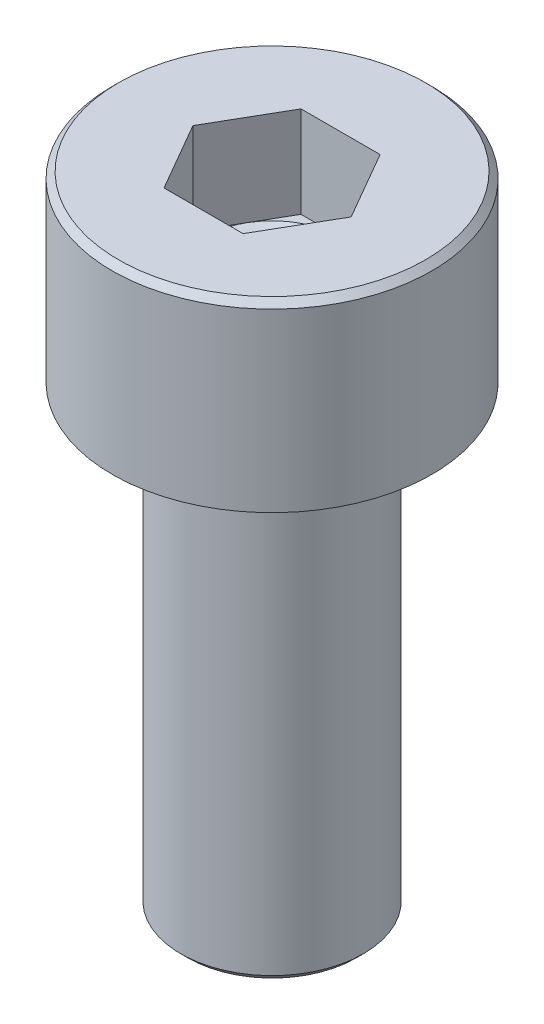
ISO-10303-21;
HEADER;
FILE_DESCRIPTION(('STEP AP214'),'2;1');
FILE_NAME('part.step','',(''),(''),'','','');
FILE_SCHEMA(('AUTOMOTIVE_DESIGN { 1 0 10303 214 1 1 1 1 }'));
ENDSEC;
DATA;
#1=APPLICATION_CONTEXT('core data for automotive mechanical design processes');
#2=APPLICATION_PROTOCOL_DEFINITION('international standard','automotive_design',2000,#1);
#3=PRODUCT_CONTEXT('',#1,'mechanical');
#4=PRODUCT('Part','Part','',(#3));
#5=PRODUCT_RELATED_PRODUCT_CATEGORY('part','',(#4));
#6=PRODUCT_DEFINITION_FORMATION('','',#4);
#7=PRODUCT_DEFINITION_CONTEXT('part definition',#1,'design');
#8=PRODUCT_DEFINITION('design','',#6,#7);
#9=PRODUCT_DEFINITION_SHAPE('','',#8);
#10=(LENGTH_UNIT() NAMED_UNIT(*) SI_UNIT(.MILLI.,.METRE.));
#11=(NAMED_UNIT(*) PLANE_ANGLE_UNIT() SI_UNIT($,.RADIAN.));
#12=(NAMED_UNIT(*) SI_UNIT($,.STERADIAN.) SOLID_ANGLE_UNIT());
#13=UNCERTAINTY_MEASURE_WITH_UNIT(LENGTH_MEASURE(1.E-05),#10,'distance_accuracy_value','');
#14=(GEOMETRIC_REPRESENTATION_CONTEXT(3) GLOBAL_UNCERTAINTY_ASSIGNED_CONTEXT((#13)) GLOBAL_UNIT_ASSIGNED_CONTEXT((#10,
#11,#12)) REPRESENTATION_CONTEXT('',''));
#15=CARTESIAN_POINT('',(0.,0.,0.));
#16=DIRECTION('',(0.,0.,1.));
#17=DIRECTION('',(1.,0.,0.));
#18=AXIS2_PLACEMENT_3D('',#15,#16,#17);
#19=CARTESIAN_POINT('',(3.5,0.,0.));
#20=DIRECTION('',(0.,1.,0.));
#21=DIRECTION('',(-1.,0.,0.));
#22=AXIS2_PLACEMENT_3D('',#19,#20,#21);
#23=PLANE('',#22);
#24=DIRECTION('',(-0.5,0.,0.866025403784439));
#25=VECTOR('',#24,1.);
#26=CARTESIAN_POINT('',(-0.866025403784439,0.,-1.5));
#27=LINE('',#26,#25);
#28=CARTESIAN_POINT('',(-0.866025403784439,0.,-1.5));
#29=VERTEX_POINT('',#28);
#30=CARTESIAN_POINT('',(-1.73205080756888,0.,0.));
#31=VERTEX_POINT('',#30);
#32=EDGE_CURVE('E160',#29,#31,#27,.T.);
#33=ORIENTED_EDGE('',*,*,#32,.F.);
#34=DIRECTION('',(-1.,0.,0.));
#35=VECTOR('',#34,1.);
#36=CARTESIAN_POINT('',(0.866025403784437,0.,-1.5));
#37=LINE('',#36,#35);
#38=CARTESIAN_POINT('',(0.866025403784437,0.,-1.5));
#39=VERTEX_POINT('',#38);
#40=EDGE_CURVE('E158',#39,#29,#37,.T.);
#41=ORIENTED_EDGE('',*,*,#40,.F.);
#42=DIRECTION('',(-0.5,0.,-0.866025403784439));
#43=VECTOR('',#42,1.);
#44=CARTESIAN_POINT('',(1.73205080756888,0.,0.));
#45=LINE('',#44,#43);
#46=CARTESIAN_POINT('',(1.73205080756888,0.,0.));
#47=VERTEX_POINT('',#46);
#48=EDGE_CURVE('E156',#47,#39,#45,.T.);
#49=ORIENTED_EDGE('',*,*,#48,.F.);
#50=DIRECTION('',(0.5,0.,-0.866025403784439));
#51=VECTOR('',#50,1.);
#52=CARTESIAN_POINT('',(0.866025403784439,0.,1.5));
#53=LINE('',#52,#51);
#54=CARTESIAN_POINT('',(0.866025403784439,0.,1.5));
#55=VERTEX_POINT('',#54);
#56=EDGE_CURVE('E154',#55,#47,#53,.T.);
#57=ORIENTED_EDGE('',*,*,#56,.F.);
#58=DIRECTION('',(1.,0.,0.));
#59=VECTOR('',#58,1.);
#60=CARTESIAN_POINT('',(-0.86602540378444,0.,1.5));
#61=LINE('',#60,#59);
#62=CARTESIAN_POINT('',(-0.86602540378444,0.,1.5));
#63=VERTEX_POINT('',#62);
#64=EDGE_CURVE('E129',#63,#55,#61,.T.);
#65=ORIENTED_EDGE('',*,*,#64,.F.);
#66=DIRECTION('',(0.5,0.,0.866025403784439));
#67=VECTOR('',#66,1.);
#68=CARTESIAN_POINT('',(-1.73205080756888,0.,0.));
#69=LINE('',#68,#67);
#70=EDGE_CURVE('E122',#31,#63,#69,.T.);
#71=ORIENTED_EDGE('',*,*,#70,.F.);
#72=EDGE_LOOP('',(#33,#41,#49,#57,#65,#71));
#73=FACE_BOUND('',#72,.T.);
#74=CARTESIAN_POINT('',(0.,0.,0.));
#75=DIRECTION('',(0.,1.,0.));
#76=DIRECTION('',(-1.,0.,0.));
#77=AXIS2_PLACEMENT_3D('',#74,#75,#76);
#78=CIRCLE('',#77,3.36000000000001);
#79=CARTESIAN_POINT('',(-3.36000000000001,0.,0.));
#80=VERTEX_POINT('',#79);
#81=EDGE_CURVE('E47',#80,#80,#78,.T.);
#82=ORIENTED_EDGE('',*,*,#81,.T.);
#83=EDGE_LOOP('',(#82));
#84=FACE_BOUND('',#83,.T.);
#85=ADVANCED_FACE('F38',(#73,#84),#23,.T.);
#86=CARTESIAN_POINT('',(2.,-14.,0.));
#87=DIRECTION('',(0.,-1.,0.));
#88=DIRECTION('',(1.,0.,0.));
#89=AXIS2_PLACEMENT_3D('',#86,#87,#88);
#90=PLANE('',#89);
#91=CARTESIAN_POINT('',(0.,-14.,0.));
#92=DIRECTION('',(0.,-1.,0.));
#93=DIRECTION('',(1.,0.,0.));
#94=AXIS2_PLACEMENT_3D('',#91,#92,#93);
#95=CIRCLE('',#94,0.75);
#96=CARTESIAN_POINT('',(0.750000000000002,-14.,0.));
#97=VERTEX_POINT('',#96);
#98=EDGE_CURVE('E267',#97,#97,#95,.T.);
#99=ORIENTED_EDGE('',*,*,#98,.F.);
#100=EDGE_LOOP('',(#99));
#101=FACE_BOUND('',#100,.T.);
#102=CARTESIAN_POINT('',(0.,-14.,0.));
#103=DIRECTION('',(0.,-1.,0.));
#104=DIRECTION('',(1.,0.,0.));
#105=AXIS2_PLACEMENT_3D('',#102,#103,#104);
#106=CIRCLE('',#105,1.84);
#107=CARTESIAN_POINT('',(1.84000000000001,-14.,0.));
#108=VERTEX_POINT('',#107);
#109=EDGE_CURVE('E190',#108,#108,#106,.T.);
#110=ORIENTED_EDGE('',*,*,#109,.T.);
#111=EDGE_LOOP('',(#110));
#112=FACE_BOUND('',#111,.T.);
#113=ADVANCED_FACE('F210',(#101,#112),#90,.T.);
#114=CARTESIAN_POINT('',(0.,-2.86602540378443,0.));
#115=DIRECTION('',(0.,1.,0.));
#116=DIRECTION('',(-1.,0.,0.));
#117=AXIS2_PLACEMENT_3D('',#114,#115,#116);
#118=CYLINDRICAL_SURFACE('',#117,2.);
#119=CARTESIAN_POINT('',(0.,-13.84,0.));
#120=DIRECTION('',(0.,-1.,0.));
#121=DIRECTION('',(1.,0.,0.));
#122=AXIS2_PLACEMENT_3D('',#119,#120,#121);
#123=CIRCLE('',#122,2.);
#124=CARTESIAN_POINT('',(2.,-13.84,0.));
#125=VERTEX_POINT('',#124);
#126=EDGE_CURVE('E187',#125,#125,#123,.F.);
#127=ORIENTED_EDGE('',*,*,#126,.T.);
#128=EDGE_LOOP('',(#127));
#129=FACE_BOUND('',#128,.T.);
#130=CARTESIAN_POINT('',(0.,-4.,0.));
#131=DIRECTION('',(0.,1.,0.));
#132=DIRECTION('',(-1.,0.,0.));
#133=AXIS2_PLACEMENT_3D('',#130,#131,#132);
#134=CIRCLE('',#133,2.);
#135=CARTESIAN_POINT('',(-2.,-4.,0.));
#136=VERTEX_POINT('',#135);
#137=EDGE_CURVE('E180',#136,#136,#134,.T.);
#138=ORIENTED_EDGE('',*,*,#137,.F.);
#139=EDGE_LOOP('',(#138));
#140=FACE_BOUND('',#139,.T.);
#141=ADVANCED_FACE('F216',(#129,#140),#118,.T.);
#142=CARTESIAN_POINT('',(2.,-4.,0.));
#143=DIRECTION('',(0.,-1.,0.));
#144=DIRECTION('',(1.,0.,0.));
#145=AXIS2_PLACEMENT_3D('',#142,#143,#144);
#146=PLANE('',#145);
#147=ORIENTED_EDGE('',*,*,#137,.T.);
#148=EDGE_LOOP('',(#147));
#149=FACE_BOUND('',#148,.T.);
#150=CARTESIAN_POINT('',(0.,-4.,0.));
#151=DIRECTION('',(0.,1.,0.));
#152=DIRECTION('',(-1.,0.,0.));
#153=AXIS2_PLACEMENT_3D('',#150,#151,#152);
#154=CIRCLE('',#153,3.5);
#155=CARTESIAN_POINT('',(-3.5,-4.,0.));
#156=VERTEX_POINT('',#155);
#157=EDGE_CURVE('E166',#156,#156,#154,.T.);
#158=ORIENTED_EDGE('',*,*,#157,.F.);
#159=EDGE_LOOP('',(#158));
#160=FACE_BOUND('',#159,.T.);
#161=ADVANCED_FACE('F229',(#149,#160),#146,.T.);
#162=CARTESIAN_POINT('',(0.,-2.86602540378443,0.));
#163=DIRECTION('',(0.,1.,0.));
#164=DIRECTION('',(-1.,0.,0.));
#165=AXIS2_PLACEMENT_3D('',#162,#163,#164);
#166=CYLINDRICAL_SURFACE('',#165,3.5);
#167=CARTESIAN_POINT('',(0.,-0.139999999999995,0.));
#168=DIRECTION('',(0.,1.,0.));
#169=DIRECTION('',(-1.,0.,0.));
#170=AXIS2_PLACEMENT_3D('',#167,#168,#169);
#171=CIRCLE('',#170,3.5);
#172=CARTESIAN_POINT('',(-3.5,-0.139999999999996,0.));
#173=VERTEX_POINT('',#172);
#174=EDGE_CURVE('E11',#173,#173,#171,.F.);
#175=ORIENTED_EDGE('',*,*,#174,.T.);
#176=EDGE_LOOP('',(#175));
#177=FACE_BOUND('',#176,.T.);
#178=ORIENTED_EDGE('',*,*,#157,.T.);
#179=EDGE_LOOP('',(#178));
#180=FACE_BOUND('',#179,.T.);
#181=ADVANCED_FACE('F206',(#177,#180),#166,.T.);
#182=CARTESIAN_POINT('',(0.,-13.84,0.));
#183=DIRECTION('',(0.,1.,0.));
#184=DIRECTION('',(-1.,0.,0.));
#185=AXIS2_PLACEMENT_3D('',#182,#183,#184);
#186=CONICAL_SURFACE('',#185,2.,0.78539816339745);
#187=ORIENTED_EDGE('',*,*,#109,.F.);
#188=EDGE_LOOP('',(#187));
#189=FACE_BOUND('',#188,.T.);
#190=ORIENTED_EDGE('',*,*,#126,.F.);
#191=EDGE_LOOP('',(#190));
#192=FACE_BOUND('',#191,.T.);
#193=ADVANCED_FACE('F198',(#189,#192),#186,.T.);
#194=CARTESIAN_POINT('',(0.,0.,0.));
#195=DIRECTION('',(0.,-1.,0.));
#196=DIRECTION('',(1.,0.,0.));
#197=AXIS2_PLACEMENT_3D('',#194,#195,#196);
#198=CONICAL_SURFACE('',#197,3.36000000000001,0.785398163397444);
#199=ORIENTED_EDGE('',*,*,#174,.F.);
#200=EDGE_LOOP('',(#199));
#201=FACE_BOUND('',#200,.T.);
#202=ORIENTED_EDGE('',*,*,#81,.F.);
#203=EDGE_LOOP('',(#202));
#204=FACE_BOUND('',#203,.T.);
#205=ADVANCED_FACE('F40',(#201,#204),#198,.T.);
#206=CARTESIAN_POINT('',(-0.866025403784439,-2.,1.5));
#207=DIRECTION('',(0.,0.,1.));
#208=DIRECTION('',(1.,0.,0.));
#209=AXIS2_PLACEMENT_3D('',#206,#207,#208);
#210=PLANE('',#209);
#211=DIRECTION('',(1.,0.,0.));
#212=VECTOR('',#211,1.);
#213=CARTESIAN_POINT('',(-0.866025403784439,-2.,1.5));
#214=LINE('',#213,#212);
#215=CARTESIAN_POINT('',(-0.866025403784439,-2.,1.5));
#216=VERTEX_POINT('',#215);
#217=CARTESIAN_POINT('',(0.,-2.,1.5));
#218=VERTEX_POINT('',#217);
#219=EDGE_CURVE('E121',#216,#218,#214,.T.);
#220=ORIENTED_EDGE('',*,*,#219,.F.);
#221=DIRECTION('',(0.,1.,0.));
#222=VECTOR('',#221,1.);
#223=CARTESIAN_POINT('',(-0.866025403784439,-2.,1.5));
#224=LINE('',#223,#222);
#225=EDGE_CURVE('E164',#216,#63,#224,.T.);
#226=ORIENTED_EDGE('',*,*,#225,.T.);
#227=ORIENTED_EDGE('',*,*,#64,.T.);
#228=DIRECTION('',(0.,1.,0.));
#229=VECTOR('',#228,1.);
#230=CARTESIAN_POINT('',(0.866025403784439,-2.,1.5));
#231=LINE('',#230,#229);
#232=CARTESIAN_POINT('',(0.866025403784439,-2.,1.5));
#233=VERTEX_POINT('',#232);
#234=EDGE_CURVE('E125',#233,#55,#231,.T.);
#235=ORIENTED_EDGE('',*,*,#234,.F.);
#236=EDGE_CURVE('E111',#218,#233,#214,.T.);
#237=ORIENTED_EDGE('',*,*,#236,.F.);
#238=EDGE_LOOP('',(#220,#226,#227,#235,#237));
#239=FACE_BOUND('',#238,.T.);
#240=ADVANCED_FACE('F126',(#239),#210,.F.);
#241=CARTESIAN_POINT('',(-1.73205080756888,-2.,0.));
#242=DIRECTION('',(-0.866025403784439,0.,0.5));
#243=DIRECTION('',(0.5,0.,0.866025403784439));
#244=AXIS2_PLACEMENT_3D('',#241,#242,#243);
#245=PLANE('',#244);
#246=DIRECTION('',(0.5,0.,0.866025403784439));
#247=VECTOR('',#246,1.);
#248=CARTESIAN_POINT('',(-1.73205080756888,-2.,0.));
#249=LINE('',#248,#247);
#250=CARTESIAN_POINT('',(-1.73205080756888,-2.,0.));
#251=VERTEX_POINT('',#250);
#252=CARTESIAN_POINT('',(-1.29903810567666,-2.,0.75));
#253=VERTEX_POINT('',#252);
#254=EDGE_CURVE('E54',#251,#253,#249,.T.);
#255=ORIENTED_EDGE('',*,*,#254,.F.);
#256=DIRECTION('',(0.,1.,0.));
#257=VECTOR('',#256,1.);
#258=CARTESIAN_POINT('',(-1.73205080756888,-2.,0.));
#259=LINE('',#258,#257);
#260=EDGE_CURVE('E167',#251,#31,#259,.T.);
#261=ORIENTED_EDGE('',*,*,#260,.T.);
#262=ORIENTED_EDGE('',*,*,#70,.T.);
#263=ORIENTED_EDGE('',*,*,#225,.F.);
#264=EDGE_CURVE('E151',#253,#216,#249,.T.);
#265=ORIENTED_EDGE('',*,*,#264,.F.);
#266=EDGE_LOOP('',(#255,#261,#262,#263,#265));
#267=FACE_BOUND('',#266,.T.);
#268=ADVANCED_FACE('F204',(#267),#245,.F.);
#269=CARTESIAN_POINT('',(-0.866025403784439,-2.,-1.5));
#270=DIRECTION('',(-0.866025403784439,0.,-0.5));
#271=DIRECTION('',(-0.5,0.,0.866025403784439));
#272=AXIS2_PLACEMENT_3D('',#269,#270,#271);
#273=PLANE('',#272);
#274=DIRECTION('',(-0.5,0.,0.866025403784439));
#275=VECTOR('',#274,1.);
#276=CARTESIAN_POINT('',(-0.866025403784439,-2.,-1.5));
#277=LINE('',#276,#275);
#278=CARTESIAN_POINT('',(-0.866025403784439,-2.,-1.5));
#279=VERTEX_POINT('',#278);
#280=CARTESIAN_POINT('',(-1.29903810567666,-2.,-0.75));
#281=VERTEX_POINT('',#280);
#282=EDGE_CURVE('E148',#279,#281,#277,.T.);
#283=ORIENTED_EDGE('',*,*,#282,.F.);
#284=DIRECTION('',(0.,1.,0.));
#285=VECTOR('',#284,1.);
#286=CARTESIAN_POINT('',(-0.866025403784439,-2.,-1.5));
#287=LINE('',#286,#285);
#288=EDGE_CURVE('E170',#279,#29,#287,.T.);
#289=ORIENTED_EDGE('',*,*,#288,.T.);
#290=ORIENTED_EDGE('',*,*,#32,.T.);
#291=ORIENTED_EDGE('',*,*,#260,.F.);
#292=EDGE_CURVE('E147',#281,#251,#277,.T.);
#293=ORIENTED_EDGE('',*,*,#292,.F.);
#294=EDGE_LOOP('',(#283,#289,#290,#291,#293));
#295=FACE_BOUND('',#294,.T.);
#296=ADVANCED_FACE('F247',(#295),#273,.F.);
#297=CARTESIAN_POINT('',(0.866025403784437,-2.,-1.5));
#298=DIRECTION('',(0.,0.,-1.));
#299=DIRECTION('',(-1.,0.,0.));
#300=AXIS2_PLACEMENT_3D('',#297,#298,#299);
#301=PLANE('',#300);
#302=DIRECTION('',(-1.,0.,0.));
#303=VECTOR('',#302,1.);
#304=CARTESIAN_POINT('',(0.866025403784437,-2.,-1.5));
#305=LINE('',#304,#303);
#306=CARTESIAN_POINT('',(0.866025403784437,-2.,-1.5));
#307=VERTEX_POINT('',#306);
#308=CARTESIAN_POINT('',(0.,-2.,-1.5));
#309=VERTEX_POINT('',#308);
#310=EDGE_CURVE('E144',#307,#309,#305,.T.);
#311=ORIENTED_EDGE('',*,*,#310,.F.);
#312=DIRECTION('',(0.,1.,0.));
#313=VECTOR('',#312,1.);
#314=CARTESIAN_POINT('',(0.866025403784437,-2.,-1.5));
#315=LINE('',#314,#313);
#316=EDGE_CURVE('E173',#307,#39,#315,.T.);
#317=ORIENTED_EDGE('',*,*,#316,.T.);
#318=ORIENTED_EDGE('',*,*,#40,.T.);
#319=ORIENTED_EDGE('',*,*,#288,.F.);
#320=EDGE_CURVE('E143',#309,#279,#305,.T.);
#321=ORIENTED_EDGE('',*,*,#320,.F.);
#322=EDGE_LOOP('',(#311,#317,#318,#319,#321));
#323=FACE_BOUND('',#322,.T.);
#324=ADVANCED_FACE('F243',(#323),#301,.F.);
#325=CARTESIAN_POINT('',(1.73205080756888,-2.,0.));
#326=DIRECTION('',(0.866025403784439,0.,-0.5));
#327=DIRECTION('',(-0.5,0.,-0.866025403784439));
#328=AXIS2_PLACEMENT_3D('',#325,#326,#327);
#329=PLANE('',#328);
#330=DIRECTION('',(-0.5,0.,-0.866025403784439));
#331=VECTOR('',#330,1.);
#332=CARTESIAN_POINT('',(1.73205080756888,-2.,0.));
#333=LINE('',#332,#331);
#334=CARTESIAN_POINT('',(1.73205080756888,-2.,0.));
#335=VERTEX_POINT('',#334);
#336=CARTESIAN_POINT('',(1.29903810567666,-2.,-0.75));
#337=VERTEX_POINT('',#336);
#338=EDGE_CURVE('E139',#335,#337,#333,.T.);
#339=ORIENTED_EDGE('',*,*,#338,.F.);
#340=DIRECTION('',(0.,1.,0.));
#341=VECTOR('',#340,1.);
#342=CARTESIAN_POINT('',(1.73205080756888,-2.,0.));
#343=LINE('',#342,#341);
#344=EDGE_CURVE('E132',#335,#47,#343,.T.);
#345=ORIENTED_EDGE('',*,*,#344,.T.);
#346=ORIENTED_EDGE('',*,*,#48,.T.);
#347=ORIENTED_EDGE('',*,*,#316,.F.);
#348=EDGE_CURVE('E137',#337,#307,#333,.T.);
#349=ORIENTED_EDGE('',*,*,#348,.F.);
#350=EDGE_LOOP('',(#339,#345,#346,#347,#349));
#351=FACE_BOUND('',#350,.T.);
#352=ADVANCED_FACE('F240',(#351),#329,.F.);
#353=CARTESIAN_POINT('',(0.866025403784439,-2.,1.5));
#354=DIRECTION('',(0.866025403784439,0.,0.5));
#355=DIRECTION('',(0.5,0.,-0.866025403784439));
#356=AXIS2_PLACEMENT_3D('',#353,#354,#355);
#357=PLANE('',#356);
#358=DIRECTION('',(0.5,0.,-0.866025403784439));
#359=VECTOR('',#358,1.);
#360=CARTESIAN_POINT('',(0.866025403784439,-2.,1.5));
#361=LINE('',#360,#359);
#362=CARTESIAN_POINT('',(1.29903810567666,-2.,0.75));
#363=VERTEX_POINT('',#362);
#364=EDGE_CURVE('E115',#233,#363,#361,.T.);
#365=ORIENTED_EDGE('',*,*,#364,.F.);
#366=ORIENTED_EDGE('',*,*,#234,.T.);
#367=ORIENTED_EDGE('',*,*,#56,.T.);
#368=ORIENTED_EDGE('',*,*,#344,.F.);
#369=EDGE_CURVE('E136',#363,#335,#361,.T.);
#370=ORIENTED_EDGE('',*,*,#369,.F.);
#371=EDGE_LOOP('',(#365,#366,#367,#368,#370));
#372=FACE_BOUND('',#371,.T.);
#373=ADVANCED_FACE('F134',(#372),#357,.F.);
#374=CARTESIAN_POINT('',(0.866025403784439,-2.,1.5));
#375=DIRECTION('',(0.,1.,0.));
#376=DIRECTION('',(-1.,0.,0.));
#377=AXIS2_PLACEMENT_3D('',#374,#375,#376);
#378=PLANE('',#377);
#379=ORIENTED_EDGE('',*,*,#264,.T.);
#380=ORIENTED_EDGE('',*,*,#219,.T.);
#381=CARTESIAN_POINT('',(0.,-2.,0.));
#382=DIRECTION('',(0.,1.,0.));
#383=DIRECTION('',(-1.,0.,0.));
#384=AXIS2_PLACEMENT_3D('',#381,#382,#383);
#385=CIRCLE('',#384,1.5);
#386=EDGE_CURVE('E184',#253,#218,#385,.T.);
#387=ORIENTED_EDGE('',*,*,#386,.F.);
#388=EDGE_LOOP('',(#379,#380,#387));
#389=FACE_BOUND('',#388,.T.);
#390=ADVANCED_FACE('F239',(#389),#378,.T.);
#391=ORIENTED_EDGE('',*,*,#236,.T.);
#392=ORIENTED_EDGE('',*,*,#364,.T.);
#393=EDGE_CURVE('E117',#218,#363,#385,.T.);
#394=ORIENTED_EDGE('',*,*,#393,.F.);
#395=EDGE_LOOP('',(#391,#392,#394));
#396=FACE_BOUND('',#395,.T.);
#397=ADVANCED_FACE('F113',(#396),#378,.T.);
#398=ORIENTED_EDGE('',*,*,#369,.T.);
#399=ORIENTED_EDGE('',*,*,#338,.T.);
#400=EDGE_CURVE('E62',#363,#337,#385,.T.);
#401=ORIENTED_EDGE('',*,*,#400,.F.);
#402=EDGE_LOOP('',(#398,#399,#401));
#403=FACE_BOUND('',#402,.T.);
#404=ADVANCED_FACE('F288',(#403),#378,.T.);
#405=ORIENTED_EDGE('',*,*,#348,.T.);
#406=ORIENTED_EDGE('',*,*,#310,.T.);
#407=EDGE_CURVE('E290',#337,#309,#385,.T.);
#408=ORIENTED_EDGE('',*,*,#407,.F.);
#409=EDGE_LOOP('',(#405,#406,#408));
#410=FACE_BOUND('',#409,.T.);
#411=ADVANCED_FACE('F298',(#410),#378,.T.);
#412=ORIENTED_EDGE('',*,*,#320,.T.);
#413=ORIENTED_EDGE('',*,*,#282,.T.);
#414=EDGE_CURVE('E291',#309,#281,#385,.T.);
#415=ORIENTED_EDGE('',*,*,#414,.F.);
#416=EDGE_LOOP('',(#412,#413,#415));
#417=FACE_BOUND('',#416,.T.);
#418=ADVANCED_FACE('F257',(#417),#378,.T.);
#419=ORIENTED_EDGE('',*,*,#292,.T.);
#420=ORIENTED_EDGE('',*,*,#254,.T.);
#421=EDGE_CURVE('E183',#281,#253,#385,.T.);
#422=ORIENTED_EDGE('',*,*,#421,.F.);
#423=EDGE_LOOP('',(#419,#420,#422));
#424=FACE_BOUND('',#423,.T.);
#425=ADVANCED_FACE('F224',(#424),#378,.T.);
#426=CARTESIAN_POINT('',(0.,-2.86602540378443,0.));
#427=DIRECTION('',(0.,1.,0.));
#428=DIRECTION('',(-1.,0.,0.));
#429=AXIS2_PLACEMENT_3D('',#426,#427,#428);
#430=CONICAL_SURFACE('',#429,0.,1.0471975511966);
#431=CARTESIAN_POINT('',(0.,-2.43301270189222,0.));
#432=DIRECTION('',(0.,1.,0.));
#433=DIRECTION('',(-1.,0.,0.));
#434=AXIS2_PLACEMENT_3D('',#431,#432,#433);
#435=CIRCLE('',#434,0.75);
#436=CARTESIAN_POINT('',(-0.75,-2.43301270189222,0.));
#437=VERTEX_POINT('',#436);
#438=EDGE_CURVE('E42',#437,#437,#435,.T.);
#439=ORIENTED_EDGE('',*,*,#438,.F.);
#440=EDGE_LOOP('',(#439));
#441=FACE_BOUND('',#440,.T.);
#442=ORIENTED_EDGE('',*,*,#386,.T.);
#443=ORIENTED_EDGE('',*,*,#393,.T.);
#444=ORIENTED_EDGE('',*,*,#400,.T.);
#445=ORIENTED_EDGE('',*,*,#407,.T.);
#446=ORIENTED_EDGE('',*,*,#414,.T.);
#447=ORIENTED_EDGE('',*,*,#421,.T.);
#448=EDGE_LOOP('',(#442,#443,#444,#445,#446,#447));
#449=FACE_BOUND('',#448,.T.);
#450=ADVANCED_FACE('F221',(#441,#449),#430,.F.);
#451=CARTESIAN_POINT('',(0.,0.,0.));
#452=DIRECTION('',(0.,-1.,0.));
#453=DIRECTION('',(1.,0.,0.));
#454=AXIS2_PLACEMENT_3D('',#451,#452,#453);
#455=CYLINDRICAL_SURFACE('',#454,0.75);
#456=ORIENTED_EDGE('',*,*,#438,.T.);
#457=EDGE_LOOP('',(#456));
#458=FACE_BOUND('',#457,.T.);
#459=ORIENTED_EDGE('',*,*,#98,.T.);
#460=EDGE_LOOP('',(#459));
#461=FACE_BOUND('',#460,.T.);
#462=ADVANCED_FACE('F223',(#458,#461),#455,.F.);
#463=CLOSED_SHELL('',(#85,#113,#141,#161,#181,#193,#205,#240,#268,#296,#324,#352,#373,#390,#397,
#404,#411,#418,#425,#450,#462));
#464=MANIFOLD_SOLID_BREP('B2',#463);
#465=ADVANCED_BREP_SHAPE_REPRESENTATION('',(#18,#464),#14);
#466=SHAPE_DEFINITION_REPRESENTATION(#9,#465);
ENDSEC;
END-ISO-10303-21;
